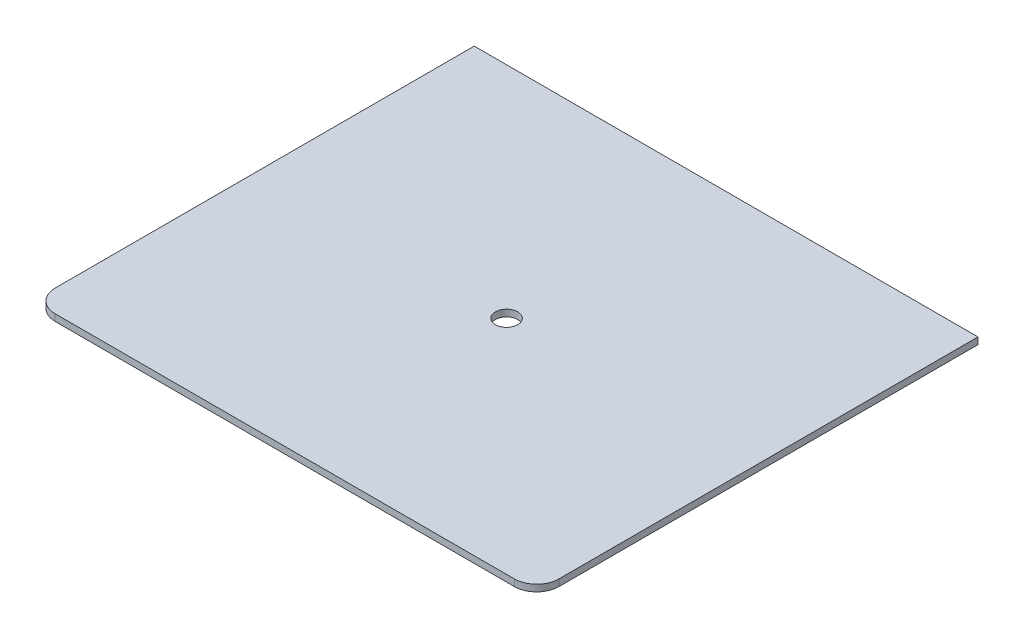
ISO-10303-21;
HEADER;
FILE_DESCRIPTION(('STEP AP214'),'2;1');
FILE_NAME('part.step','',(''),(''),'','','');
FILE_SCHEMA(('AUTOMOTIVE_DESIGN { 1 0 10303 214 1 1 1 1 }'));
ENDSEC;
DATA;
#1=APPLICATION_CONTEXT('core data for automotive mechanical design processes');
#2=APPLICATION_PROTOCOL_DEFINITION('international standard','automotive_design',2000,#1);
#3=PRODUCT_CONTEXT('',#1,'mechanical');
#4=PRODUCT('Part','Part','',(#3));
#5=PRODUCT_RELATED_PRODUCT_CATEGORY('part','',(#4));
#6=PRODUCT_DEFINITION_FORMATION('','',#4);
#7=PRODUCT_DEFINITION_CONTEXT('part definition',#1,'design');
#8=PRODUCT_DEFINITION('design','',#6,#7);
#9=PRODUCT_DEFINITION_SHAPE('','',#8);
#10=(LENGTH_UNIT() NAMED_UNIT(*) SI_UNIT(.MILLI.,.METRE.));
#11=(NAMED_UNIT(*) PLANE_ANGLE_UNIT() SI_UNIT($,.RADIAN.));
#12=(NAMED_UNIT(*) SI_UNIT($,.STERADIAN.) SOLID_ANGLE_UNIT());
#13=UNCERTAINTY_MEASURE_WITH_UNIT(LENGTH_MEASURE(1.E-05),#10,'distance_accuracy_value','');
#14=(GEOMETRIC_REPRESENTATION_CONTEXT(3) GLOBAL_UNCERTAINTY_ASSIGNED_CONTEXT((#13)) GLOBAL_UNIT_ASSIGNED_CONTEXT((#10,
#11,#12)) REPRESENTATION_CONTEXT('',''));
#15=CARTESIAN_POINT('',(0.,0.,0.));
#16=DIRECTION('',(0.,0.,1.));
#17=DIRECTION('',(1.,0.,0.));
#18=AXIS2_PLACEMENT_3D('',#15,#16,#17);
#19=CARTESIAN_POINT('',(0.,3.,0.));
#20=DIRECTION('',(1.,0.,0.));
#21=DIRECTION('',(0.,0.,-1.));
#22=AXIS2_PLACEMENT_3D('',#19,#20,#21);
#23=PLANE('',#22);
#24=DIRECTION('',(0.,0.,1.));
#25=VECTOR('',#24,1.);
#26=CARTESIAN_POINT('',(0.,0.,0.));
#27=LINE('',#26,#25);
#28=CARTESIAN_POINT('',(0.,0.,-198.));
#29=VERTEX_POINT('',#28);
#30=CARTESIAN_POINT('',(0.,0.,-10.));
#31=VERTEX_POINT('',#30);
#32=EDGE_CURVE('E112',#29,#31,#27,.T.);
#33=ORIENTED_EDGE('',*,*,#32,.T.);
#34=DIRECTION('',(0.,-1.,0.));
#35=VECTOR('',#34,1.);
#36=CARTESIAN_POINT('',(0.,3.,-10.));
#37=LINE('',#36,#35);
#38=CARTESIAN_POINT('',(0.,3.,-10.));
#39=VERTEX_POINT('',#38);
#40=EDGE_CURVE('E56',#31,#39,#37,.F.);
#41=ORIENTED_EDGE('',*,*,#40,.T.);
#42=DIRECTION('',(0.,0.,1.));
#43=VECTOR('',#42,1.);
#44=CARTESIAN_POINT('',(0.,3.,0.));
#45=LINE('',#44,#43);
#46=CARTESIAN_POINT('',(0.,3.,-198.));
#47=VERTEX_POINT('',#46);
#48=EDGE_CURVE('E120',#47,#39,#45,.T.);
#49=ORIENTED_EDGE('',*,*,#48,.F.);
#50=DIRECTION('',(0.,-1.,0.));
#51=VECTOR('',#50,1.);
#52=CARTESIAN_POINT('',(0.,3.,-198.));
#53=LINE('',#52,#51);
#54=EDGE_CURVE('E104',#47,#29,#53,.T.);
#55=ORIENTED_EDGE('',*,*,#54,.T.);
#56=EDGE_LOOP('',(#33,#41,#49,#55));
#57=FACE_BOUND('',#56,.T.);
#58=ADVANCED_FACE('F33',(#57),#23,.F.);
#59=CARTESIAN_POINT('',(0.,3.,0.));
#60=DIRECTION('',(0.,0.,-1.));
#61=DIRECTION('',(-1.,0.,0.));
#62=AXIS2_PLACEMENT_3D('',#59,#60,#61);
#63=PLANE('',#62);
#64=DIRECTION('',(1.,0.,0.));
#65=VECTOR('',#64,1.);
#66=CARTESIAN_POINT('',(0.,3.,0.));
#67=LINE('',#66,#65);
#68=CARTESIAN_POINT('',(10.,3.,0.));
#69=VERTEX_POINT('',#68);
#70=CARTESIAN_POINT('',(216.,3.,0.));
#71=VERTEX_POINT('',#70);
#72=EDGE_CURVE('E94',#69,#71,#67,.T.);
#73=ORIENTED_EDGE('',*,*,#72,.F.);
#74=DIRECTION('',(0.,-1.,0.));
#75=VECTOR('',#74,1.);
#76=CARTESIAN_POINT('',(10.,3.,0.));
#77=LINE('',#76,#75);
#78=CARTESIAN_POINT('',(10.,0.,0.));
#79=VERTEX_POINT('',#78);
#80=EDGE_CURVE('E126',#69,#79,#77,.T.);
#81=ORIENTED_EDGE('',*,*,#80,.T.);
#82=DIRECTION('',(1.,0.,0.));
#83=VECTOR('',#82,1.);
#84=CARTESIAN_POINT('',(0.,0.,0.));
#85=LINE('',#84,#83);
#86=CARTESIAN_POINT('',(216.,0.,0.));
#87=VERTEX_POINT('',#86);
#88=EDGE_CURVE('E114',#79,#87,#85,.T.);
#89=ORIENTED_EDGE('',*,*,#88,.T.);
#90=DIRECTION('',(0.,-1.,0.));
#91=VECTOR('',#90,1.);
#92=CARTESIAN_POINT('',(216.,3.,0.));
#93=LINE('',#92,#91);
#94=EDGE_CURVE('E103',#87,#71,#93,.F.);
#95=ORIENTED_EDGE('',*,*,#94,.T.);
#96=EDGE_LOOP('',(#73,#81,#89,#95));
#97=FACE_BOUND('',#96,.T.);
#98=ADVANCED_FACE('F139',(#97),#63,.F.);
#99=CARTESIAN_POINT('',(226.,3.,0.));
#100=DIRECTION('',(-1.,0.,0.));
#101=DIRECTION('',(0.,0.,1.));
#102=AXIS2_PLACEMENT_3D('',#99,#100,#101);
#103=PLANE('',#102);
#104=DIRECTION('',(0.,0.,-1.));
#105=VECTOR('',#104,1.);
#106=CARTESIAN_POINT('',(226.,3.,0.));
#107=LINE('',#106,#105);
#108=CARTESIAN_POINT('',(226.,3.,-10.));
#109=VERTEX_POINT('',#108);
#110=CARTESIAN_POINT('',(226.,3.,-198.));
#111=VERTEX_POINT('',#110);
#112=EDGE_CURVE('E86',#109,#111,#107,.T.);
#113=ORIENTED_EDGE('',*,*,#112,.F.);
#114=DIRECTION('',(0.,-1.,0.));
#115=VECTOR('',#114,1.);
#116=CARTESIAN_POINT('',(226.,3.,-10.));
#117=LINE('',#116,#115);
#118=CARTESIAN_POINT('',(226.,0.,-10.));
#119=VERTEX_POINT('',#118);
#120=EDGE_CURVE('E11',#109,#119,#117,.T.);
#121=ORIENTED_EDGE('',*,*,#120,.T.);
#122=DIRECTION('',(0.,0.,-1.));
#123=VECTOR('',#122,1.);
#124=CARTESIAN_POINT('',(226.,0.,0.));
#125=LINE('',#124,#123);
#126=CARTESIAN_POINT('',(226.,0.,-198.));
#127=VERTEX_POINT('',#126);
#128=EDGE_CURVE('E100',#119,#127,#125,.T.);
#129=ORIENTED_EDGE('',*,*,#128,.T.);
#130=DIRECTION('',(0.,-1.,0.));
#131=VECTOR('',#130,1.);
#132=CARTESIAN_POINT('',(226.,3.,-198.));
#133=LINE('',#132,#131);
#134=EDGE_CURVE('E97',#111,#127,#133,.T.);
#135=ORIENTED_EDGE('',*,*,#134,.F.);
#136=EDGE_LOOP('',(#113,#121,#129,#135));
#137=FACE_BOUND('',#136,.T.);
#138=ADVANCED_FACE('F98',(#137),#103,.F.);
#139=CARTESIAN_POINT('',(0.,3.,-198.));
#140=DIRECTION('',(0.,0.,1.));
#141=DIRECTION('',(1.,0.,0.));
#142=AXIS2_PLACEMENT_3D('',#139,#140,#141);
#143=PLANE('',#142);
#144=DIRECTION('',(-1.,0.,0.));
#145=VECTOR('',#144,1.);
#146=CARTESIAN_POINT('',(0.,0.,-198.));
#147=LINE('',#146,#145);
#148=EDGE_CURVE('E119',#127,#29,#147,.T.);
#149=ORIENTED_EDGE('',*,*,#148,.T.);
#150=ORIENTED_EDGE('',*,*,#54,.F.);
#151=DIRECTION('',(-1.,0.,0.));
#152=VECTOR('',#151,1.);
#153=CARTESIAN_POINT('',(0.,3.,-198.));
#154=LINE('',#153,#152);
#155=EDGE_CURVE('E90',#111,#47,#154,.T.);
#156=ORIENTED_EDGE('',*,*,#155,.F.);
#157=ORIENTED_EDGE('',*,*,#134,.T.);
#158=EDGE_LOOP('',(#149,#150,#156,#157));
#159=FACE_BOUND('',#158,.T.);
#160=ADVANCED_FACE('F106',(#159),#143,.F.);
#161=CARTESIAN_POINT('',(0.,3.,0.));
#162=DIRECTION('',(0.,-1.,0.));
#163=DIRECTION('',(0.,0.,-1.));
#164=AXIS2_PLACEMENT_3D('',#161,#162,#163);
#165=PLANE('',#164);
#166=CARTESIAN_POINT('',(113.,3.,-99.5));
#167=DIRECTION('',(0.,1.,0.));
#168=DIRECTION('',(0.,0.,1.));
#169=AXIS2_PLACEMENT_3D('',#166,#167,#168);
#170=CIRCLE('',#169,5.00000000000001);
#171=CARTESIAN_POINT('',(113.,3.,-94.5));
#172=VERTEX_POINT('',#171);
#173=EDGE_CURVE('E124',#172,#172,#170,.T.);
#174=ORIENTED_EDGE('',*,*,#173,.F.);
#175=EDGE_LOOP('',(#174));
#176=FACE_BOUND('',#175,.T.);
#177=ORIENTED_EDGE('',*,*,#48,.T.);
#178=CARTESIAN_POINT('',(10.,3.,-10.));
#179=DIRECTION('',(0.,-1.,0.));
#180=DIRECTION('',(0.,0.,-1.));
#181=AXIS2_PLACEMENT_3D('',#178,#179,#180);
#182=CIRCLE('',#181,10.);
#183=EDGE_CURVE('E41',#39,#69,#182,.F.);
#184=ORIENTED_EDGE('',*,*,#183,.T.);
#185=ORIENTED_EDGE('',*,*,#72,.T.);
#186=CARTESIAN_POINT('',(216.,3.,-10.));
#187=DIRECTION('',(0.,-1.,0.));
#188=DIRECTION('',(0.,0.,-1.));
#189=AXIS2_PLACEMENT_3D('',#186,#187,#188);
#190=CIRCLE('',#189,10.);
#191=EDGE_CURVE('E48',#71,#109,#190,.F.);
#192=ORIENTED_EDGE('',*,*,#191,.T.);
#193=ORIENTED_EDGE('',*,*,#112,.T.);
#194=ORIENTED_EDGE('',*,*,#155,.T.);
#195=EDGE_LOOP('',(#177,#184,#185,#192,#193,#194));
#196=FACE_BOUND('',#195,.T.);
#197=ADVANCED_FACE('F88',(#176,#196),#165,.F.);
#198=CARTESIAN_POINT('',(0.,0.,0.));
#199=DIRECTION('',(0.,-1.,0.));
#200=DIRECTION('',(0.,0.,-1.));
#201=AXIS2_PLACEMENT_3D('',#198,#199,#200);
#202=PLANE('',#201);
#203=CARTESIAN_POINT('',(113.,0.,-99.5));
#204=DIRECTION('',(0.,-1.,0.));
#205=DIRECTION('',(0.,0.,-1.));
#206=AXIS2_PLACEMENT_3D('',#203,#204,#205);
#207=CIRCLE('',#206,5.00000000000001);
#208=CARTESIAN_POINT('',(113.,0.,-104.5));
#209=VERTEX_POINT('',#208);
#210=EDGE_CURVE('E115',#209,#209,#207,.T.);
#211=ORIENTED_EDGE('',*,*,#210,.F.);
#212=EDGE_LOOP('',(#211));
#213=FACE_BOUND('',#212,.T.);
#214=ORIENTED_EDGE('',*,*,#88,.F.);
#215=CARTESIAN_POINT('',(10.,0.,-10.));
#216=DIRECTION('',(0.,-1.,0.));
#217=DIRECTION('',(0.,0.,-1.));
#218=AXIS2_PLACEMENT_3D('',#215,#216,#217);
#219=CIRCLE('',#218,10.);
#220=EDGE_CURVE('E131',#79,#31,#219,.T.);
#221=ORIENTED_EDGE('',*,*,#220,.T.);
#222=ORIENTED_EDGE('',*,*,#32,.F.);
#223=ORIENTED_EDGE('',*,*,#148,.F.);
#224=ORIENTED_EDGE('',*,*,#128,.F.);
#225=CARTESIAN_POINT('',(216.,0.,-10.));
#226=DIRECTION('',(0.,-1.,0.));
#227=DIRECTION('',(0.,0.,-1.));
#228=AXIS2_PLACEMENT_3D('',#225,#226,#227);
#229=CIRCLE('',#228,10.);
#230=EDGE_CURVE('E129',#119,#87,#229,.T.);
#231=ORIENTED_EDGE('',*,*,#230,.T.);
#232=EDGE_LOOP('',(#214,#221,#222,#223,#224,#231));
#233=FACE_BOUND('',#232,.T.);
#234=ADVANCED_FACE('F145',(#213,#233),#202,.T.);
#235=CARTESIAN_POINT('',(113.,-7.,-99.5));
#236=DIRECTION('',(0.,1.,0.));
#237=DIRECTION('',(0.,0.,1.));
#238=AXIS2_PLACEMENT_3D('',#235,#236,#237);
#239=CYLINDRICAL_SURFACE('',#238,5.00000000000001);
#240=ORIENTED_EDGE('',*,*,#210,.T.);
#241=EDGE_LOOP('',(#240));
#242=FACE_BOUND('',#241,.T.);
#243=ORIENTED_EDGE('',*,*,#173,.T.);
#244=EDGE_LOOP('',(#243));
#245=FACE_BOUND('',#244,.T.);
#246=ADVANCED_FACE('F151',(#242,#245),#239,.F.);
#247=CARTESIAN_POINT('',(10.,3.,-10.));
#248=DIRECTION('',(0.,-1.,0.));
#249=DIRECTION('',(0.,0.,-1.));
#250=AXIS2_PLACEMENT_3D('',#247,#248,#249);
#251=CYLINDRICAL_SURFACE('',#250,10.);
#252=ORIENTED_EDGE('',*,*,#183,.F.);
#253=ORIENTED_EDGE('',*,*,#40,.F.);
#254=ORIENTED_EDGE('',*,*,#220,.F.);
#255=ORIENTED_EDGE('',*,*,#80,.F.);
#256=EDGE_LOOP('',(#252,#253,#254,#255));
#257=FACE_BOUND('',#256,.T.);
#258=ADVANCED_FACE('F142',(#257),#251,.T.);
#259=CARTESIAN_POINT('',(216.,3.,-10.));
#260=DIRECTION('',(0.,-1.,0.));
#261=DIRECTION('',(0.,0.,-1.));
#262=AXIS2_PLACEMENT_3D('',#259,#260,#261);
#263=CYLINDRICAL_SURFACE('',#262,10.);
#264=ORIENTED_EDGE('',*,*,#191,.F.);
#265=ORIENTED_EDGE('',*,*,#94,.F.);
#266=ORIENTED_EDGE('',*,*,#230,.F.);
#267=ORIENTED_EDGE('',*,*,#120,.F.);
#268=EDGE_LOOP('',(#264,#265,#266,#267));
#269=FACE_BOUND('',#268,.T.);
#270=ADVANCED_FACE('F35',(#269),#263,.T.);
#271=CLOSED_SHELL('',(#58,#98,#138,#160,#197,#234,#246,#258,#270));
#272=MANIFOLD_SOLID_BREP('B2',#271);
#273=ADVANCED_BREP_SHAPE_REPRESENTATION('',(#18,#272),#14);
#274=SHAPE_DEFINITION_REPRESENTATION(#9,#273);
ENDSEC;
END-ISO-10303-21;
